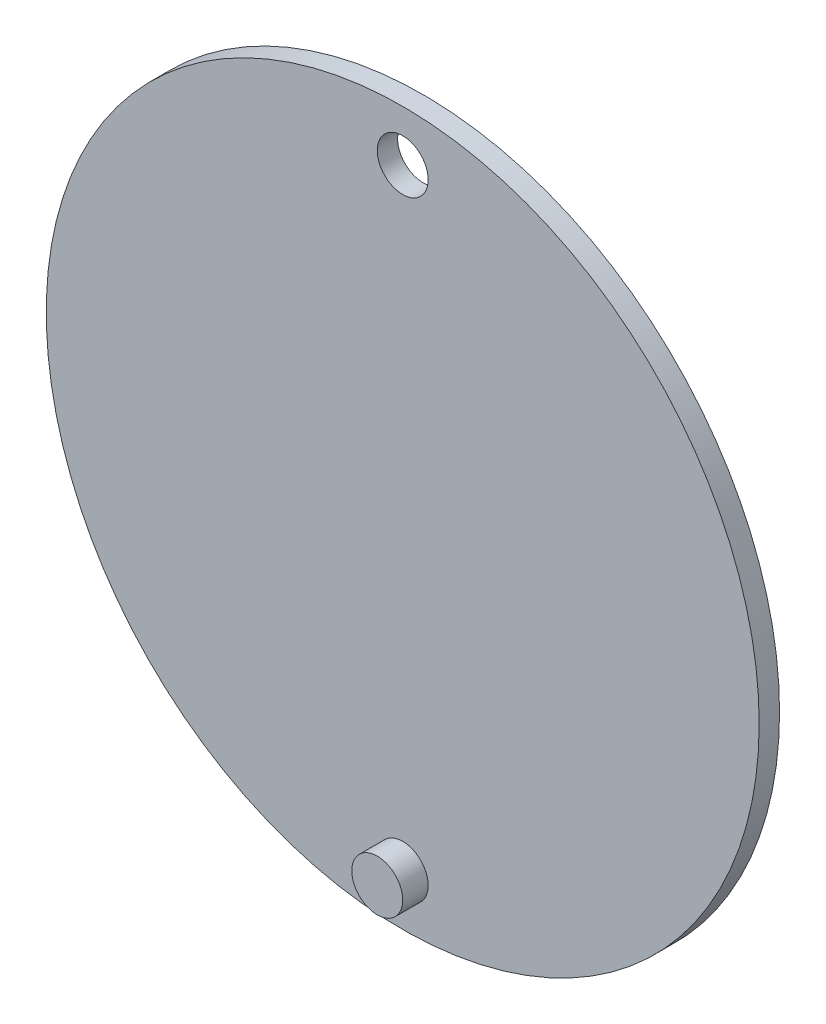
ISO-10303-21;
HEADER;
FILE_DESCRIPTION(('STEP AP214'),'2;1');
FILE_NAME('part.step','',(''),(''),'','','');
FILE_SCHEMA(('AUTOMOTIVE_DESIGN { 1 0 10303 214 1 1 1 1 }'));
ENDSEC;
DATA;
#1=APPLICATION_CONTEXT('core data for automotive mechanical design processes');
#2=APPLICATION_PROTOCOL_DEFINITION('international standard','automotive_design',2000,#1);
#3=PRODUCT_CONTEXT('',#1,'mechanical');
#4=PRODUCT('Part','Part','',(#3));
#5=PRODUCT_RELATED_PRODUCT_CATEGORY('part','',(#4));
#6=PRODUCT_DEFINITION_FORMATION('','',#4);
#7=PRODUCT_DEFINITION_CONTEXT('part definition',#1,'design');
#8=PRODUCT_DEFINITION('design','',#6,#7);
#9=PRODUCT_DEFINITION_SHAPE('','',#8);
#10=(LENGTH_UNIT() NAMED_UNIT(*) SI_UNIT(.MILLI.,.METRE.));
#11=(NAMED_UNIT(*) PLANE_ANGLE_UNIT() SI_UNIT($,.RADIAN.));
#12=(NAMED_UNIT(*) SI_UNIT($,.STERADIAN.) SOLID_ANGLE_UNIT());
#13=UNCERTAINTY_MEASURE_WITH_UNIT(LENGTH_MEASURE(1.E-05),#10,'distance_accuracy_value','');
#14=(GEOMETRIC_REPRESENTATION_CONTEXT(3) GLOBAL_UNCERTAINTY_ASSIGNED_CONTEXT((#13)) GLOBAL_UNIT_ASSIGNED_CONTEXT((#10,
#11,#12)) REPRESENTATION_CONTEXT('',''));
#15=CARTESIAN_POINT('',(0.,0.,0.));
#16=DIRECTION('',(0.,0.,1.));
#17=DIRECTION('',(1.,0.,0.));
#18=AXIS2_PLACEMENT_3D('',#15,#16,#17);
#19=CARTESIAN_POINT('',(0.,0.,5.08));
#20=DIRECTION('',(0.,0.,1.));
#21=DIRECTION('',(1.,0.,0.));
#22=AXIS2_PLACEMENT_3D('',#19,#20,#21);
#23=PLANE('',#22);
#24=CARTESIAN_POINT('',(0.,-76.2,5.08));
#25=DIRECTION('',(0.,0.,1.));
#26=DIRECTION('',(1.,0.,0.));
#27=AXIS2_PLACEMENT_3D('',#24,#25,#26);
#28=CIRCLE('',#27,6.35);
#29=CARTESIAN_POINT('',(6.35,-76.2,5.08));
#30=VERTEX_POINT('',#29);
#31=EDGE_CURVE('E54',#30,#30,#28,.T.);
#32=ORIENTED_EDGE('',*,*,#31,.F.);
#33=EDGE_LOOP('',(#32));
#34=FACE_BOUND('',#33,.T.);
#35=CARTESIAN_POINT('',(0.,0.,5.08));
#36=DIRECTION('',(0.,0.,1.));
#37=DIRECTION('',(1.,0.,0.));
#38=AXIS2_PLACEMENT_3D('',#35,#36,#37);
#39=CIRCLE('',#38,88.9);
#40=CARTESIAN_POINT('',(88.9,0.,5.08));
#41=VERTEX_POINT('',#40);
#42=EDGE_CURVE('E10',#41,#41,#39,.T.);
#43=ORIENTED_EDGE('',*,*,#42,.T.);
#44=EDGE_LOOP('',(#43));
#45=FACE_BOUND('',#44,.T.);
#46=CARTESIAN_POINT('',(0.,76.2,5.08));
#47=DIRECTION('',(0.,0.,1.));
#48=DIRECTION('',(1.,0.,0.));
#49=AXIS2_PLACEMENT_3D('',#46,#47,#48);
#50=CIRCLE('',#49,6.35);
#51=CARTESIAN_POINT('',(6.35,76.2,5.08));
#52=VERTEX_POINT('',#51);
#53=EDGE_CURVE('E59',#52,#52,#50,.T.);
#54=ORIENTED_EDGE('',*,*,#53,.F.);
#55=EDGE_LOOP('',(#54));
#56=FACE_BOUND('',#55,.T.);
#57=ADVANCED_FACE('F41',(#34,#45,#56),#23,.T.);
#58=CARTESIAN_POINT('',(0.,0.,0.));
#59=DIRECTION('',(0.,0.,1.));
#60=DIRECTION('',(1.,0.,0.));
#61=AXIS2_PLACEMENT_3D('',#58,#59,#60);
#62=PLANE('',#61);
#63=CARTESIAN_POINT('',(0.,0.,0.));
#64=DIRECTION('',(0.,0.,1.));
#65=DIRECTION('',(1.,0.,0.));
#66=AXIS2_PLACEMENT_3D('',#63,#64,#65);
#67=CIRCLE('',#66,88.9);
#68=CARTESIAN_POINT('',(88.9,0.,0.));
#69=VERTEX_POINT('',#68);
#70=EDGE_CURVE('E45',#69,#69,#67,.T.);
#71=ORIENTED_EDGE('',*,*,#70,.F.);
#72=EDGE_LOOP('',(#71));
#73=FACE_BOUND('',#72,.T.);
#74=CARTESIAN_POINT('',(0.,0.,0.));
#75=DIRECTION('',(0.,0.,1.));
#76=DIRECTION('',(1.,0.,0.));
#77=AXIS2_PLACEMENT_3D('',#74,#75,#76);
#78=CIRCLE('',#77,6.35);
#79=CARTESIAN_POINT('',(6.35,0.,0.));
#80=VERTEX_POINT('',#79);
#81=EDGE_CURVE('E71',#80,#80,#78,.T.);
#82=ORIENTED_EDGE('',*,*,#81,.T.);
#83=EDGE_LOOP('',(#82));
#84=FACE_BOUND('',#83,.T.);
#85=CARTESIAN_POINT('',(0.,76.2,0.));
#86=DIRECTION('',(0.,0.,1.));
#87=DIRECTION('',(1.,0.,0.));
#88=AXIS2_PLACEMENT_3D('',#85,#86,#87);
#89=CIRCLE('',#88,6.35);
#90=CARTESIAN_POINT('',(6.35,76.2,0.));
#91=VERTEX_POINT('',#90);
#92=EDGE_CURVE('E60',#91,#91,#89,.T.);
#93=ORIENTED_EDGE('',*,*,#92,.T.);
#94=EDGE_LOOP('',(#93));
#95=FACE_BOUND('',#94,.T.);
#96=ADVANCED_FACE('F92',(#73,#84,#95),#62,.F.);
#97=CARTESIAN_POINT('',(0.,0.,5.08));
#98=DIRECTION('',(0.,0.,-1.));
#99=DIRECTION('',(-1.,0.,0.));
#100=AXIS2_PLACEMENT_3D('',#97,#98,#99);
#101=CYLINDRICAL_SURFACE('',#100,88.9);
#102=ORIENTED_EDGE('',*,*,#42,.F.);
#103=EDGE_LOOP('',(#102));
#104=FACE_BOUND('',#103,.T.);
#105=ORIENTED_EDGE('',*,*,#70,.T.);
#106=EDGE_LOOP('',(#105));
#107=FACE_BOUND('',#106,.T.);
#108=ADVANCED_FACE('F43',(#104,#107),#101,.T.);
#109=CARTESIAN_POINT('',(0.,76.2,5.08));
#110=DIRECTION('',(0.,0.,-1.));
#111=DIRECTION('',(-1.,0.,0.));
#112=AXIS2_PLACEMENT_3D('',#109,#110,#111);
#113=CYLINDRICAL_SURFACE('',#112,6.35);
#114=ORIENTED_EDGE('',*,*,#53,.T.);
#115=EDGE_LOOP('',(#114));
#116=FACE_BOUND('',#115,.T.);
#117=ORIENTED_EDGE('',*,*,#92,.F.);
#118=EDGE_LOOP('',(#117));
#119=FACE_BOUND('',#118,.T.);
#120=ADVANCED_FACE('F102',(#116,#119),#113,.F.);
#121=CARTESIAN_POINT('',(0.,-76.2,11.43));
#122=DIRECTION('',(0.,0.,-1.));
#123=DIRECTION('',(-1.,0.,0.));
#124=AXIS2_PLACEMENT_3D('',#121,#122,#123);
#125=CYLINDRICAL_SURFACE('',#124,6.35);
#126=ORIENTED_EDGE('',*,*,#31,.T.);
#127=EDGE_LOOP('',(#126));
#128=FACE_BOUND('',#127,.T.);
#129=CARTESIAN_POINT('',(0.,-76.2,11.43));
#130=DIRECTION('',(0.,0.,1.));
#131=DIRECTION('',(1.,0.,0.));
#132=AXIS2_PLACEMENT_3D('',#129,#130,#131);
#133=CIRCLE('',#132,6.35);
#134=CARTESIAN_POINT('',(6.35,-76.2,11.43));
#135=VERTEX_POINT('',#134);
#136=EDGE_CURVE('E64',#135,#135,#133,.T.);
#137=ORIENTED_EDGE('',*,*,#136,.F.);
#138=EDGE_LOOP('',(#137));
#139=FACE_BOUND('',#138,.T.);
#140=ADVANCED_FACE('F105',(#128,#139),#125,.T.);
#141=CARTESIAN_POINT('',(0.,-76.2,11.43));
#142=DIRECTION('',(0.,0.,1.));
#143=DIRECTION('',(1.,0.,0.));
#144=AXIS2_PLACEMENT_3D('',#141,#142,#143);
#145=PLANE('',#144);
#146=ORIENTED_EDGE('',*,*,#136,.T.);
#147=EDGE_LOOP('',(#146));
#148=FACE_BOUND('',#147,.T.);
#149=ADVANCED_FACE('F89',(#148),#145,.T.);
#150=CARTESIAN_POINT('',(0.,0.,-45.72));
#151=DIRECTION('',(0.,0.,1.));
#152=DIRECTION('',(1.,0.,0.));
#153=AXIS2_PLACEMENT_3D('',#150,#151,#152);
#154=CYLINDRICAL_SURFACE('',#153,6.35);
#155=CARTESIAN_POINT('',(0.,0.,-45.72));
#156=DIRECTION('',(0.,0.,1.));
#157=DIRECTION('',(1.,0.,0.));
#158=AXIS2_PLACEMENT_3D('',#155,#156,#157);
#159=CIRCLE('',#158,6.35);
#160=CARTESIAN_POINT('',(6.35,0.,-45.72));
#161=VERTEX_POINT('',#160);
#162=EDGE_CURVE('E75',#161,#161,#159,.T.);
#163=ORIENTED_EDGE('',*,*,#162,.T.);
#164=EDGE_LOOP('',(#163));
#165=FACE_BOUND('',#164,.T.);
#166=ORIENTED_EDGE('',*,*,#81,.F.);
#167=EDGE_LOOP('',(#166));
#168=FACE_BOUND('',#167,.T.);
#169=ADVANCED_FACE('F80',(#165,#168),#154,.T.);
#170=CARTESIAN_POINT('',(0.,0.,-45.72));
#171=DIRECTION('',(0.,0.,1.));
#172=DIRECTION('',(1.,0.,0.));
#173=AXIS2_PLACEMENT_3D('',#170,#171,#172);
#174=PLANE('',#173);
#175=ORIENTED_EDGE('',*,*,#162,.F.);
#176=EDGE_LOOP('',(#175));
#177=FACE_BOUND('',#176,.T.);
#178=ADVANCED_FACE('F83',(#177),#174,.F.);
#179=CLOSED_SHELL('',(#57,#96,#108,#120,#140,#149,#169,#178));
#180=MANIFOLD_SOLID_BREP('B2',#179);
#181=ADVANCED_BREP_SHAPE_REPRESENTATION('',(#18,#180),#14);
#182=SHAPE_DEFINITION_REPRESENTATION(#9,#181);
ENDSEC;
END-ISO-10303-21;
